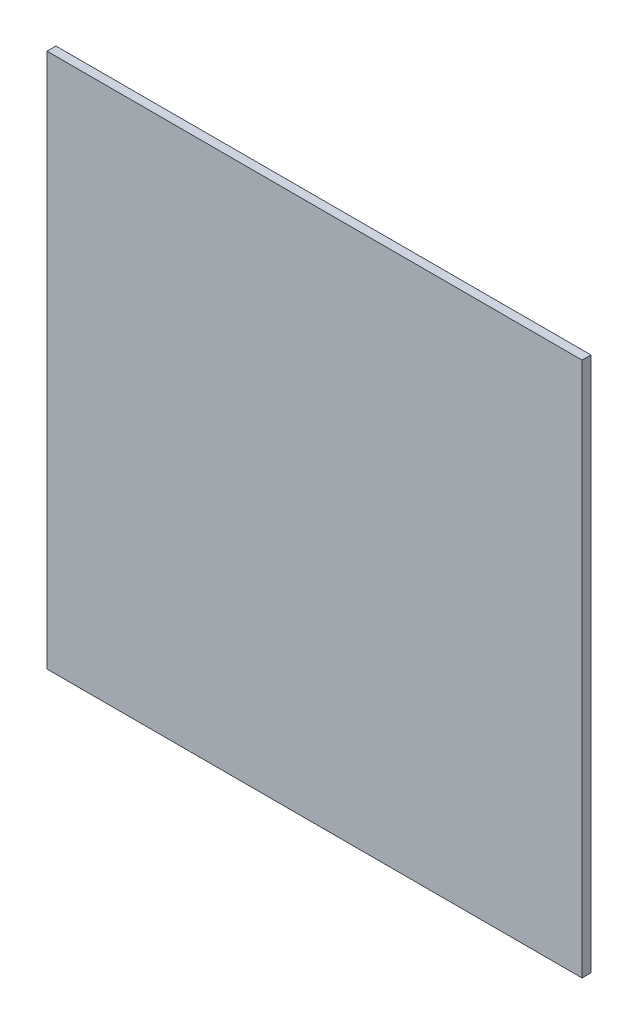
ISO-10303-21;
HEADER;
FILE_DESCRIPTION(('STEP AP214'),'2;1');
FILE_NAME('part.step','',(''),(''),'','','');
FILE_SCHEMA(('AUTOMOTIVE_DESIGN { 1 0 10303 214 1 1 1 1 }'));
ENDSEC;
DATA;
#1=APPLICATION_CONTEXT('core data for automotive mechanical design processes');
#2=APPLICATION_PROTOCOL_DEFINITION('international standard','automotive_design',2000,#1);
#3=PRODUCT_CONTEXT('',#1,'mechanical');
#4=PRODUCT('Part','Part','',(#3));
#5=PRODUCT_RELATED_PRODUCT_CATEGORY('part','',(#4));
#6=PRODUCT_DEFINITION_FORMATION('','',#4);
#7=PRODUCT_DEFINITION_CONTEXT('part definition',#1,'design');
#8=PRODUCT_DEFINITION('design','',#6,#7);
#9=PRODUCT_DEFINITION_SHAPE('','',#8);
#10=(LENGTH_UNIT() NAMED_UNIT(*) SI_UNIT(.MILLI.,.METRE.));
#11=(NAMED_UNIT(*) PLANE_ANGLE_UNIT() SI_UNIT($,.RADIAN.));
#12=(NAMED_UNIT(*) SI_UNIT($,.STERADIAN.) SOLID_ANGLE_UNIT());
#13=UNCERTAINTY_MEASURE_WITH_UNIT(LENGTH_MEASURE(1.E-05),#10,'distance_accuracy_value','');
#14=(GEOMETRIC_REPRESENTATION_CONTEXT(3) GLOBAL_UNCERTAINTY_ASSIGNED_CONTEXT((#13)) GLOBAL_UNIT_ASSIGNED_CONTEXT((#10,
#11,#12)) REPRESENTATION_CONTEXT('',''));
#15=CARTESIAN_POINT('',(0.,0.,0.));
#16=DIRECTION('',(0.,0.,1.));
#17=DIRECTION('',(1.,0.,0.));
#18=AXIS2_PLACEMENT_3D('',#15,#16,#17);
#19=CARTESIAN_POINT('',(150.,150.,5.));
#20=DIRECTION('',(-1.,0.,0.));
#21=DIRECTION('',(0.,-1.,0.));
#22=AXIS2_PLACEMENT_3D('',#19,#20,#21);
#23=PLANE('',#22);
#24=DIRECTION('',(0.,1.,0.));
#25=VECTOR('',#24,1.);
#26=CARTESIAN_POINT('',(150.,150.,0.));
#27=LINE('',#26,#25);
#28=CARTESIAN_POINT('',(150.,-150.,0.));
#29=VERTEX_POINT('',#28);
#30=CARTESIAN_POINT('',(150.,150.,0.));
#31=VERTEX_POINT('',#30);
#32=EDGE_CURVE('E96',#29,#31,#27,.T.);
#33=ORIENTED_EDGE('',*,*,#32,.T.);
#34=DIRECTION('',(0.,0.,-1.));
#35=VECTOR('',#34,1.);
#36=CARTESIAN_POINT('',(150.,150.,5.));
#37=LINE('',#36,#35);
#38=CARTESIAN_POINT('',(150.,150.,5.));
#39=VERTEX_POINT('',#38);
#40=EDGE_CURVE('E11',#39,#31,#37,.T.);
#41=ORIENTED_EDGE('',*,*,#40,.F.);
#42=DIRECTION('',(0.,1.,0.));
#43=VECTOR('',#42,1.);
#44=CARTESIAN_POINT('',(150.,150.,5.));
#45=LINE('',#44,#43);
#46=CARTESIAN_POINT('',(150.,-150.,5.));
#47=VERTEX_POINT('',#46);
#48=EDGE_CURVE('E84',#47,#39,#45,.T.);
#49=ORIENTED_EDGE('',*,*,#48,.F.);
#50=DIRECTION('',(0.,0.,-1.));
#51=VECTOR('',#50,1.);
#52=CARTESIAN_POINT('',(150.,-150.,5.));
#53=LINE('',#52,#51);
#54=EDGE_CURVE('E92',#47,#29,#53,.T.);
#55=ORIENTED_EDGE('',*,*,#54,.T.);
#56=EDGE_LOOP('',(#33,#41,#49,#55));
#57=FACE_BOUND('',#56,.T.);
#58=ADVANCED_FACE('F33',(#57),#23,.F.);
#59=CARTESIAN_POINT('',(-150.,150.,5.));
#60=DIRECTION('',(0.,-1.,0.));
#61=DIRECTION('',(0.,0.,-1.));
#62=AXIS2_PLACEMENT_3D('',#59,#60,#61);
#63=PLANE('',#62);
#64=DIRECTION('',(-1.,0.,0.));
#65=VECTOR('',#64,1.);
#66=CARTESIAN_POINT('',(-150.,150.,0.));
#67=LINE('',#66,#65);
#68=CARTESIAN_POINT('',(-150.,150.,0.));
#69=VERTEX_POINT('',#68);
#70=EDGE_CURVE('E88',#31,#69,#67,.T.);
#71=ORIENTED_EDGE('',*,*,#70,.T.);
#72=DIRECTION('',(0.,0.,-1.));
#73=VECTOR('',#72,1.);
#74=CARTESIAN_POINT('',(-150.,150.,5.));
#75=LINE('',#74,#73);
#76=CARTESIAN_POINT('',(-150.,150.,5.));
#77=VERTEX_POINT('',#76);
#78=EDGE_CURVE('E41',#77,#69,#75,.T.);
#79=ORIENTED_EDGE('',*,*,#78,.F.);
#80=DIRECTION('',(-1.,0.,0.));
#81=VECTOR('',#80,1.);
#82=CARTESIAN_POINT('',(-150.,150.,5.));
#83=LINE('',#82,#81);
#84=EDGE_CURVE('E79',#39,#77,#83,.T.);
#85=ORIENTED_EDGE('',*,*,#84,.F.);
#86=ORIENTED_EDGE('',*,*,#40,.T.);
#87=EDGE_LOOP('',(#71,#79,#85,#86));
#88=FACE_BOUND('',#87,.T.);
#89=ADVANCED_FACE('F87',(#88),#63,.F.);
#90=CARTESIAN_POINT('',(-150.,150.,5.));
#91=DIRECTION('',(1.,0.,0.));
#92=DIRECTION('',(0.,1.,0.));
#93=AXIS2_PLACEMENT_3D('',#90,#91,#92);
#94=PLANE('',#93);
#95=DIRECTION('',(0.,-1.,0.));
#96=VECTOR('',#95,1.);
#97=CARTESIAN_POINT('',(-150.,150.,0.));
#98=LINE('',#97,#96);
#99=CARTESIAN_POINT('',(-150.,-150.,0.));
#100=VERTEX_POINT('',#99);
#101=EDGE_CURVE('E66',#69,#100,#98,.T.);
#102=ORIENTED_EDGE('',*,*,#101,.T.);
#103=DIRECTION('',(0.,0.,-1.));
#104=VECTOR('',#103,1.);
#105=CARTESIAN_POINT('',(-150.,-150.,5.));
#106=LINE('',#105,#104);
#107=CARTESIAN_POINT('',(-150.,-150.,5.));
#108=VERTEX_POINT('',#107);
#109=EDGE_CURVE('E89',#108,#100,#106,.T.);
#110=ORIENTED_EDGE('',*,*,#109,.F.);
#111=DIRECTION('',(0.,-1.,0.));
#112=VECTOR('',#111,1.);
#113=CARTESIAN_POINT('',(-150.,150.,5.));
#114=LINE('',#113,#112);
#115=EDGE_CURVE('E82',#77,#108,#114,.T.);
#116=ORIENTED_EDGE('',*,*,#115,.F.);
#117=ORIENTED_EDGE('',*,*,#78,.T.);
#118=EDGE_LOOP('',(#102,#110,#116,#117));
#119=FACE_BOUND('',#118,.T.);
#120=ADVANCED_FACE('F90',(#119),#94,.F.);
#121=CARTESIAN_POINT('',(-150.,-150.,5.));
#122=DIRECTION('',(0.,1.,0.));
#123=DIRECTION('',(0.,0.,1.));
#124=AXIS2_PLACEMENT_3D('',#121,#122,#123);
#125=PLANE('',#124);
#126=DIRECTION('',(1.,0.,0.));
#127=VECTOR('',#126,1.);
#128=CARTESIAN_POINT('',(-150.,-150.,0.));
#129=LINE('',#128,#127);
#130=EDGE_CURVE('E72',#100,#29,#129,.T.);
#131=ORIENTED_EDGE('',*,*,#130,.T.);
#132=ORIENTED_EDGE('',*,*,#54,.F.);
#133=DIRECTION('',(1.,0.,0.));
#134=VECTOR('',#133,1.);
#135=CARTESIAN_POINT('',(-150.,-150.,5.));
#136=LINE('',#135,#134);
#137=EDGE_CURVE('E49',#108,#47,#136,.T.);
#138=ORIENTED_EDGE('',*,*,#137,.F.);
#139=ORIENTED_EDGE('',*,*,#109,.T.);
#140=EDGE_LOOP('',(#131,#132,#138,#139));
#141=FACE_BOUND('',#140,.T.);
#142=ADVANCED_FACE('F103',(#141),#125,.F.);
#143=CARTESIAN_POINT('',(0.,0.,5.));
#144=DIRECTION('',(0.,0.,1.));
#145=DIRECTION('',(1.,0.,0.));
#146=AXIS2_PLACEMENT_3D('',#143,#144,#145);
#147=PLANE('',#146);
#148=ORIENTED_EDGE('',*,*,#48,.T.);
#149=ORIENTED_EDGE('',*,*,#84,.T.);
#150=ORIENTED_EDGE('',*,*,#115,.T.);
#151=ORIENTED_EDGE('',*,*,#137,.T.);
#152=EDGE_LOOP('',(#148,#149,#150,#151));
#153=FACE_BOUND('',#152,.T.);
#154=ADVANCED_FACE('F80',(#153),#147,.T.);
#155=CARTESIAN_POINT('',(0.,0.,0.));
#156=DIRECTION('',(0.,0.,1.));
#157=DIRECTION('',(1.,0.,0.));
#158=AXIS2_PLACEMENT_3D('',#155,#156,#157);
#159=PLANE('',#158);
#160=ORIENTED_EDGE('',*,*,#32,.F.);
#161=ORIENTED_EDGE('',*,*,#130,.F.);
#162=ORIENTED_EDGE('',*,*,#101,.F.);
#163=ORIENTED_EDGE('',*,*,#70,.F.);
#164=EDGE_LOOP('',(#160,#161,#162,#163));
#165=FACE_BOUND('',#164,.T.);
#166=ADVANCED_FACE('F106',(#165),#159,.F.);
#167=CLOSED_SHELL('',(#58,#89,#120,#142,#154,#166));
#168=MANIFOLD_SOLID_BREP('B2',#167);
#169=ADVANCED_BREP_SHAPE_REPRESENTATION('',(#18,#168),#14);
#170=SHAPE_DEFINITION_REPRESENTATION(#9,#169);
ENDSEC;
END-ISO-10303-21;
